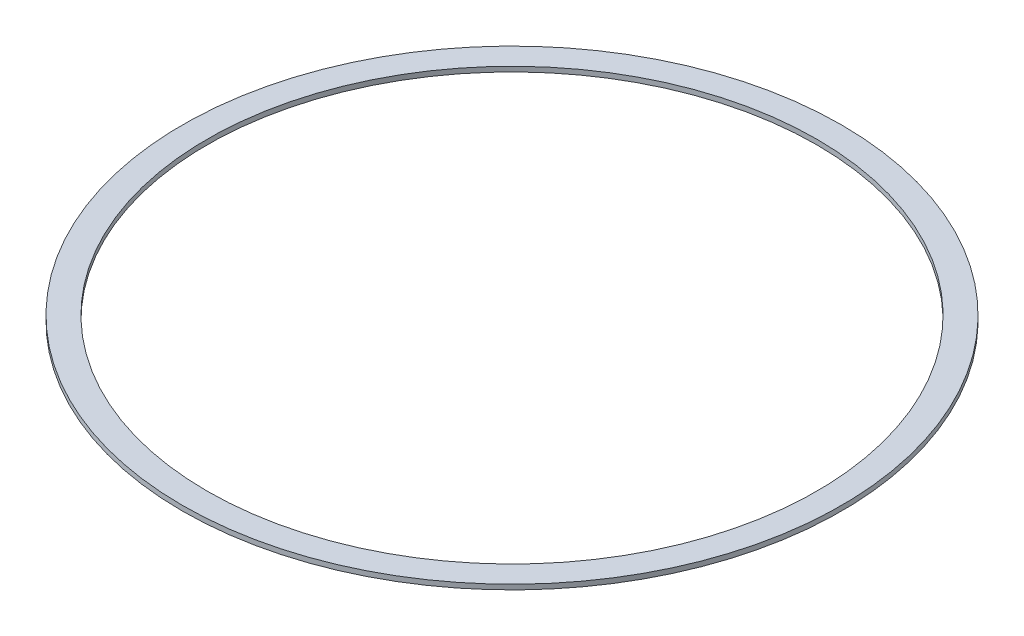
ISO-10303-21;
HEADER;
FILE_DESCRIPTION(('STEP AP214'),'2;1');
FILE_NAME('part.step','',(''),(''),'','','');
FILE_SCHEMA(('AUTOMOTIVE_DESIGN { 1 0 10303 214 1 1 1 1 }'));
ENDSEC;
DATA;
#1=APPLICATION_CONTEXT('core data for automotive mechanical design processes');
#2=APPLICATION_PROTOCOL_DEFINITION('international standard','automotive_design',2000,#1);
#3=PRODUCT_CONTEXT('',#1,'mechanical');
#4=PRODUCT('Part','Part','',(#3));
#5=PRODUCT_RELATED_PRODUCT_CATEGORY('part','',(#4));
#6=PRODUCT_DEFINITION_FORMATION('','',#4);
#7=PRODUCT_DEFINITION_CONTEXT('part definition',#1,'design');
#8=PRODUCT_DEFINITION('design','',#6,#7);
#9=PRODUCT_DEFINITION_SHAPE('','',#8);
#10=(LENGTH_UNIT() NAMED_UNIT(*) SI_UNIT(.MILLI.,.METRE.));
#11=(NAMED_UNIT(*) PLANE_ANGLE_UNIT() SI_UNIT($,.RADIAN.));
#12=(NAMED_UNIT(*) SI_UNIT($,.STERADIAN.) SOLID_ANGLE_UNIT());
#13=UNCERTAINTY_MEASURE_WITH_UNIT(LENGTH_MEASURE(1.E-05),#10,'distance_accuracy_value','');
#14=(GEOMETRIC_REPRESENTATION_CONTEXT(3) GLOBAL_UNCERTAINTY_ASSIGNED_CONTEXT((#13)) GLOBAL_UNIT_ASSIGNED_CONTEXT((#10,
#11,#12)) REPRESENTATION_CONTEXT('',''));
#15=CARTESIAN_POINT('',(0.,0.,0.));
#16=DIRECTION('',(0.,0.,1.));
#17=DIRECTION('',(1.,0.,0.));
#18=AXIS2_PLACEMENT_3D('',#15,#16,#17);
#19=CARTESIAN_POINT('',(0.,1.5,0.));
#20=DIRECTION('',(0.,1.,0.));
#21=DIRECTION('',(0.,0.,1.));
#22=AXIS2_PLACEMENT_3D('',#19,#20,#21);
#23=PLANE('',#22);
#24=CARTESIAN_POINT('',(0.,1.5,0.));
#25=DIRECTION('',(0.,1.,0.));
#26=DIRECTION('',(0.,0.,1.));
#27=AXIS2_PLACEMENT_3D('',#24,#25,#26);
#28=CIRCLE('',#27,200.);
#29=CARTESIAN_POINT('',(0.,1.5,200.));
#30=VERTEX_POINT('',#29);
#31=EDGE_CURVE('E10',#30,#30,#28,.T.);
#32=ORIENTED_EDGE('',*,*,#31,.T.);
#33=EDGE_LOOP('',(#32));
#34=FACE_BOUND('',#33,.T.);
#35=CARTESIAN_POINT('',(0.,1.5,0.));
#36=DIRECTION('',(0.,1.,0.));
#37=DIRECTION('',(0.,0.,1.));
#38=AXIS2_PLACEMENT_3D('',#35,#36,#37);
#39=CIRCLE('',#38,185.);
#40=CARTESIAN_POINT('',(0.,1.5,185.));
#41=VERTEX_POINT('',#40);
#42=EDGE_CURVE('E42',#41,#41,#39,.T.);
#43=ORIENTED_EDGE('',*,*,#42,.F.);
#44=EDGE_LOOP('',(#43));
#45=FACE_BOUND('',#44,.T.);
#46=ADVANCED_FACE('F31',(#34,#45),#23,.T.);
#47=CARTESIAN_POINT('',(0.,-1.5,0.));
#48=DIRECTION('',(0.,1.,0.));
#49=DIRECTION('',(0.,0.,1.));
#50=AXIS2_PLACEMENT_3D('',#47,#48,#49);
#51=PLANE('',#50);
#52=CARTESIAN_POINT('',(0.,-1.5,0.));
#53=DIRECTION('',(0.,1.,0.));
#54=DIRECTION('',(0.,0.,1.));
#55=AXIS2_PLACEMENT_3D('',#52,#53,#54);
#56=CIRCLE('',#55,200.);
#57=CARTESIAN_POINT('',(0.,-1.5,200.));
#58=VERTEX_POINT('',#57);
#59=EDGE_CURVE('E35',#58,#58,#56,.T.);
#60=ORIENTED_EDGE('',*,*,#59,.F.);
#61=EDGE_LOOP('',(#60));
#62=FACE_BOUND('',#61,.T.);
#63=CARTESIAN_POINT('',(0.,-1.5,0.));
#64=DIRECTION('',(0.,1.,0.));
#65=DIRECTION('',(0.,0.,1.));
#66=AXIS2_PLACEMENT_3D('',#63,#64,#65);
#67=CIRCLE('',#66,185.);
#68=CARTESIAN_POINT('',(0.,-1.5,185.));
#69=VERTEX_POINT('',#68);
#70=EDGE_CURVE('E44',#69,#69,#67,.T.);
#71=ORIENTED_EDGE('',*,*,#70,.T.);
#72=EDGE_LOOP('',(#71));
#73=FACE_BOUND('',#72,.T.);
#74=ADVANCED_FACE('F54',(#62,#73),#51,.F.);
#75=CARTESIAN_POINT('',(0.,1.5,0.));
#76=DIRECTION('',(0.,-1.,0.));
#77=DIRECTION('',(0.,0.,-1.));
#78=AXIS2_PLACEMENT_3D('',#75,#76,#77);
#79=CYLINDRICAL_SURFACE('',#78,200.);
#80=ORIENTED_EDGE('',*,*,#31,.F.);
#81=EDGE_LOOP('',(#80));
#82=FACE_BOUND('',#81,.T.);
#83=ORIENTED_EDGE('',*,*,#59,.T.);
#84=EDGE_LOOP('',(#83));
#85=FACE_BOUND('',#84,.T.);
#86=ADVANCED_FACE('F33',(#82,#85),#79,.T.);
#87=CARTESIAN_POINT('',(0.,1.5,0.));
#88=DIRECTION('',(0.,-1.,0.));
#89=DIRECTION('',(0.,0.,-1.));
#90=AXIS2_PLACEMENT_3D('',#87,#88,#89);
#91=CYLINDRICAL_SURFACE('',#90,185.);
#92=ORIENTED_EDGE('',*,*,#42,.T.);
#93=EDGE_LOOP('',(#92));
#94=FACE_BOUND('',#93,.T.);
#95=ORIENTED_EDGE('',*,*,#70,.F.);
#96=EDGE_LOOP('',(#95));
#97=FACE_BOUND('',#96,.T.);
#98=ADVANCED_FACE('F50',(#94,#97),#91,.F.);
#99=CLOSED_SHELL('',(#46,#74,#86,#98));
#100=MANIFOLD_SOLID_BREP('B2',#99);
#101=ADVANCED_BREP_SHAPE_REPRESENTATION('',(#18,#100),#14);
#102=SHAPE_DEFINITION_REPRESENTATION(#9,#101);
ENDSEC;
END-ISO-10303-21;
